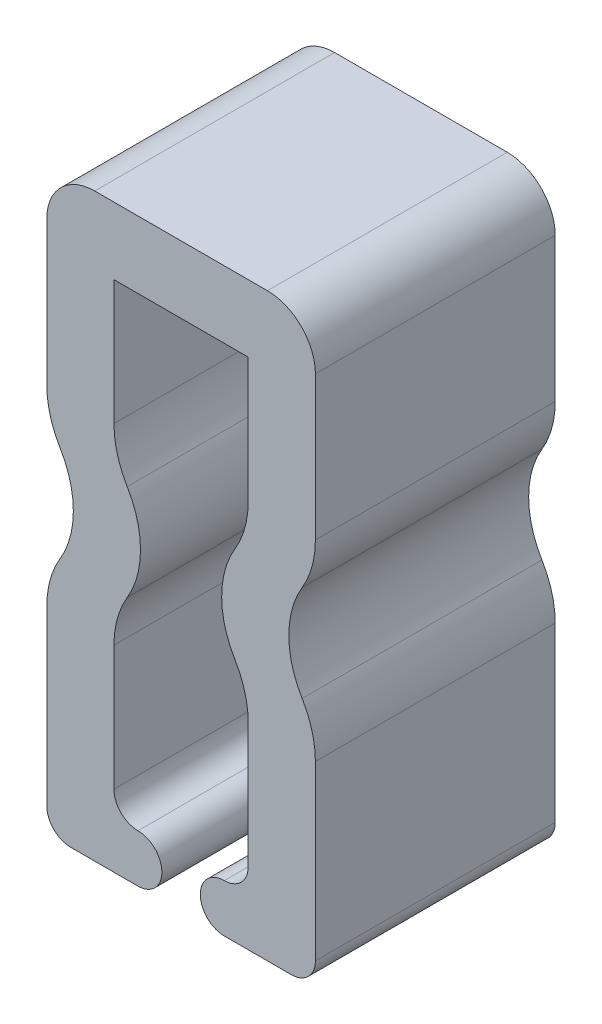
ISO-10303-21;
HEADER;
FILE_DESCRIPTION(('STEP AP214'),'2;1');
FILE_NAME('part.step','',(''),(''),'','','');
FILE_SCHEMA(('AUTOMOTIVE_DESIGN { 1 0 10303 214 1 1 1 1 }'));
ENDSEC;
DATA;
#1=APPLICATION_CONTEXT('core data for automotive mechanical design processes');
#2=APPLICATION_PROTOCOL_DEFINITION('international standard','automotive_design',2000,#1);
#3=PRODUCT_CONTEXT('',#1,'mechanical');
#4=PRODUCT('Part','Part','',(#3));
#5=PRODUCT_RELATED_PRODUCT_CATEGORY('part','',(#4));
#6=PRODUCT_DEFINITION_FORMATION('','',#4);
#7=PRODUCT_DEFINITION_CONTEXT('part definition',#1,'design');
#8=PRODUCT_DEFINITION('design','',#6,#7);
#9=PRODUCT_DEFINITION_SHAPE('','',#8);
#10=(LENGTH_UNIT() NAMED_UNIT(*) SI_UNIT(.MILLI.,.METRE.));
#11=(NAMED_UNIT(*) PLANE_ANGLE_UNIT() SI_UNIT($,.RADIAN.));
#12=(NAMED_UNIT(*) SI_UNIT($,.STERADIAN.) SOLID_ANGLE_UNIT());
#13=UNCERTAINTY_MEASURE_WITH_UNIT(LENGTH_MEASURE(1.E-05),#10,'distance_accuracy_value','');
#14=(GEOMETRIC_REPRESENTATION_CONTEXT(3) GLOBAL_UNCERTAINTY_ASSIGNED_CONTEXT((#13)) GLOBAL_UNIT_ASSIGNED_CONTEXT((#10,
#11,#12)) REPRESENTATION_CONTEXT('',''));
#15=CARTESIAN_POINT('',(0.,0.,0.));
#16=DIRECTION('',(0.,0.,1.));
#17=DIRECTION('',(1.,0.,0.));
#18=AXIS2_PLACEMENT_3D('',#15,#16,#17);
#19=CARTESIAN_POINT('',(-1.4,7.8,5.));
#20=DIRECTION('',(-1.,0.,0.));
#21=DIRECTION('',(0.,0.,1.));
#22=AXIS2_PLACEMENT_3D('',#19,#20,#21);
#23=PLANE('',#22);
#24=DIRECTION('',(0.,1.,0.));
#25=VECTOR('',#24,1.);
#26=CARTESIAN_POINT('',(-1.4,7.8,0.));
#27=LINE('',#26,#25);
#28=CARTESIAN_POINT('',(-1.4,5.2,0.));
#29=VERTEX_POINT('',#28);
#30=CARTESIAN_POINT('',(-1.4,7.8,0.));
#31=VERTEX_POINT('',#30);
#32=EDGE_CURVE('E276',#29,#31,#27,.T.);
#33=ORIENTED_EDGE('',*,*,#32,.T.);
#34=DIRECTION('',(0.,0.,-1.));
#35=VECTOR('',#34,1.);
#36=CARTESIAN_POINT('',(-1.4,7.8,5.));
#37=LINE('',#36,#35);
#38=CARTESIAN_POINT('',(-1.4,7.8,5.));
#39=VERTEX_POINT('',#38);
#40=EDGE_CURVE('E11',#39,#31,#37,.T.);
#41=ORIENTED_EDGE('',*,*,#40,.F.);
#42=DIRECTION('',(0.,1.,0.));
#43=VECTOR('',#42,1.);
#44=CARTESIAN_POINT('',(-1.4,7.8,5.));
#45=LINE('',#44,#43);
#46=CARTESIAN_POINT('',(-1.4,5.2,5.));
#47=VERTEX_POINT('',#46);
#48=EDGE_CURVE('E340',#47,#39,#45,.T.);
#49=ORIENTED_EDGE('',*,*,#48,.F.);
#50=DIRECTION('',(0.,0.,-1.));
#51=VECTOR('',#50,1.);
#52=CARTESIAN_POINT('',(-1.4,5.2,5.));
#53=LINE('',#52,#51);
#54=EDGE_CURVE('E272',#47,#29,#53,.T.);
#55=ORIENTED_EDGE('',*,*,#54,.T.);
#56=EDGE_LOOP('',(#33,#41,#49,#55));
#57=FACE_BOUND('',#56,.T.);
#58=ADVANCED_FACE('F36',(#57),#23,.F.);
#59=CARTESIAN_POINT('',(-1.4,7.8,5.));
#60=DIRECTION('',(0.,1.,0.));
#61=DIRECTION('',(0.,0.,1.));
#62=AXIS2_PLACEMENT_3D('',#59,#60,#61);
#63=PLANE('',#62);
#64=DIRECTION('',(1.,0.,0.));
#65=VECTOR('',#64,1.);
#66=CARTESIAN_POINT('',(-1.4,7.8,0.));
#67=LINE('',#66,#65);
#68=CARTESIAN_POINT('',(1.39999999999997,7.8,0.));
#69=VERTEX_POINT('',#68);
#70=EDGE_CURVE('E279',#31,#69,#67,.T.);
#71=ORIENTED_EDGE('',*,*,#70,.T.);
#72=DIRECTION('',(0.,0.,-1.));
#73=VECTOR('',#72,1.);
#74=CARTESIAN_POINT('',(1.39999999999997,7.8,5.));
#75=LINE('',#74,#73);
#76=CARTESIAN_POINT('',(1.39999999999997,7.8,5.));
#77=VERTEX_POINT('',#76);
#78=EDGE_CURVE('E44',#77,#69,#75,.T.);
#79=ORIENTED_EDGE('',*,*,#78,.F.);
#80=DIRECTION('',(1.,0.,0.));
#81=VECTOR('',#80,1.);
#82=CARTESIAN_POINT('',(-1.4,7.8,5.));
#83=LINE('',#82,#81);
#84=EDGE_CURVE('E167',#39,#77,#83,.T.);
#85=ORIENTED_EDGE('',*,*,#84,.F.);
#86=ORIENTED_EDGE('',*,*,#40,.T.);
#87=EDGE_LOOP('',(#71,#79,#85,#86));
#88=FACE_BOUND('',#87,.T.);
#89=ADVANCED_FACE('F518',(#88),#63,.F.);
#90=CARTESIAN_POINT('',(1.39999999999997,7.8,5.));
#91=DIRECTION('',(1.,0.,0.));
#92=DIRECTION('',(0.,1.,0.));
#93=AXIS2_PLACEMENT_3D('',#90,#91,#92);
#94=PLANE('',#93);
#95=DIRECTION('',(0.,-1.,0.));
#96=VECTOR('',#95,1.);
#97=CARTESIAN_POINT('',(1.39999999999997,7.8,0.));
#98=LINE('',#97,#96);
#99=CARTESIAN_POINT('',(1.39999999999999,5.2,0.));
#100=VERTEX_POINT('',#99);
#101=EDGE_CURVE('E281',#69,#100,#98,.T.);
#102=ORIENTED_EDGE('',*,*,#101,.T.);
#103=DIRECTION('',(0.,0.,-1.));
#104=VECTOR('',#103,1.);
#105=CARTESIAN_POINT('',(1.39999999999999,5.2,5.));
#106=LINE('',#105,#104);
#107=CARTESIAN_POINT('',(1.39999999999999,5.2,5.));
#108=VERTEX_POINT('',#107);
#109=EDGE_CURVE('E419',#108,#100,#106,.T.);
#110=ORIENTED_EDGE('',*,*,#109,.F.);
#111=DIRECTION('',(0.,-1.,0.));
#112=VECTOR('',#111,1.);
#113=CARTESIAN_POINT('',(1.39999999999997,7.8,5.));
#114=LINE('',#113,#112);
#115=EDGE_CURVE('E427',#77,#108,#114,.T.);
#116=ORIENTED_EDGE('',*,*,#115,.F.);
#117=ORIENTED_EDGE('',*,*,#78,.T.);
#118=EDGE_LOOP('',(#102,#110,#116,#117));
#119=FACE_BOUND('',#118,.T.);
#120=ADVANCED_FACE('F425',(#119),#94,.F.);
#121=CARTESIAN_POINT('',(-0.543650631615116,5.2,5.));
#122=DIRECTION('',(0.,0.,-1.));
#123=DIRECTION('',(-1.,0.,0.));
#124=AXIS2_PLACEMENT_3D('',#121,#122,#123);
#125=CYLINDRICAL_SURFACE('',#124,1.9436506316151);
#126=CARTESIAN_POINT('',(-0.543650631615116,5.2,0.));
#127=DIRECTION('',(0.,0.,-1.));
#128=DIRECTION('',(-1.,0.,0.));
#129=AXIS2_PLACEMENT_3D('',#126,#127,#128);
#130=CIRCLE('',#129,1.9436506316151);
#131=CARTESIAN_POINT('',(1.12301603505156,4.2,0.));
#132=VERTEX_POINT('',#131);
#133=EDGE_CURVE('E283',#100,#132,#130,.T.);
#134=ORIENTED_EDGE('',*,*,#133,.T.);
#135=DIRECTION('',(0.,0.,-1.));
#136=VECTOR('',#135,1.);
#137=CARTESIAN_POINT('',(1.12301603505156,4.2,5.));
#138=LINE('',#137,#136);
#139=CARTESIAN_POINT('',(1.12301603505156,4.2,5.));
#140=VERTEX_POINT('',#139);
#141=EDGE_CURVE('E416',#140,#132,#138,.T.);
#142=ORIENTED_EDGE('',*,*,#141,.F.);
#143=CARTESIAN_POINT('',(-0.543650631615116,5.2,5.));
#144=DIRECTION('',(0.,0.,-1.));
#145=DIRECTION('',(-1.,0.,0.));
#146=AXIS2_PLACEMENT_3D('',#143,#144,#145);
#147=CIRCLE('',#146,1.9436506316151);
#148=EDGE_CURVE('E445',#108,#140,#147,.T.);
#149=ORIENTED_EDGE('',*,*,#148,.F.);
#150=ORIENTED_EDGE('',*,*,#109,.T.);
#151=EDGE_LOOP('',(#134,#142,#149,#150));
#152=FACE_BOUND('',#151,.T.);
#153=ADVANCED_FACE('F436',(#152),#125,.F.);
#154=CARTESIAN_POINT('',(2.78968270171823,3.2,5.));
#155=DIRECTION('',(0.,0.,-1.));
#156=DIRECTION('',(-1.,0.,0.));
#157=AXIS2_PLACEMENT_3D('',#154,#155,#156);
#158=CYLINDRICAL_SURFACE('',#157,1.9436506316151);
#159=CARTESIAN_POINT('',(2.78968270171823,3.2,0.));
#160=DIRECTION('',(0.,0.,1.));
#161=DIRECTION('',(1.,0.,0.));
#162=AXIS2_PLACEMENT_3D('',#159,#160,#161);
#163=CIRCLE('',#162,1.9436506316151);
#164=CARTESIAN_POINT('',(1.12301603505157,2.2,0.));
#165=VERTEX_POINT('',#164);
#166=EDGE_CURVE('E285',#132,#165,#163,.T.);
#167=ORIENTED_EDGE('',*,*,#166,.T.);
#168=DIRECTION('',(0.,0.,-1.));
#169=VECTOR('',#168,1.);
#170=CARTESIAN_POINT('',(1.12301603505157,2.2,5.));
#171=LINE('',#170,#169);
#172=CARTESIAN_POINT('',(1.12301603505157,2.2,5.));
#173=VERTEX_POINT('',#172);
#174=EDGE_CURVE('E413',#173,#165,#171,.T.);
#175=ORIENTED_EDGE('',*,*,#174,.F.);
#176=CARTESIAN_POINT('',(2.78968270171823,3.2,5.));
#177=DIRECTION('',(0.,0.,1.));
#178=DIRECTION('',(1.,0.,0.));
#179=AXIS2_PLACEMENT_3D('',#176,#177,#178);
#180=CIRCLE('',#179,1.9436506316151);
#181=EDGE_CURVE('E442',#140,#173,#180,.T.);
#182=ORIENTED_EDGE('',*,*,#181,.F.);
#183=ORIENTED_EDGE('',*,*,#141,.T.);
#184=EDGE_LOOP('',(#167,#175,#182,#183));
#185=FACE_BOUND('',#184,.T.);
#186=ADVANCED_FACE('F440',(#185),#158,.T.);
#187=CARTESIAN_POINT('',(-0.543650631615089,1.2,5.));
#188=DIRECTION('',(0.,0.,-1.));
#189=DIRECTION('',(-1.,0.,0.));
#190=AXIS2_PLACEMENT_3D('',#187,#188,#189);
#191=CYLINDRICAL_SURFACE('',#190,1.9436506316151);
#192=CARTESIAN_POINT('',(-0.543650631615089,1.2,0.));
#193=DIRECTION('',(0.,0.,-1.));
#194=DIRECTION('',(1.,0.,0.));
#195=AXIS2_PLACEMENT_3D('',#192,#193,#194);
#196=CIRCLE('',#195,1.9436506316151);
#197=CARTESIAN_POINT('',(1.40000000000001,1.2,0.));
#198=VERTEX_POINT('',#197);
#199=EDGE_CURVE('E287',#165,#198,#196,.T.);
#200=ORIENTED_EDGE('',*,*,#199,.T.);
#201=DIRECTION('',(0.,0.,-1.));
#202=VECTOR('',#201,1.);
#203=CARTESIAN_POINT('',(1.40000000000001,1.2,5.));
#204=LINE('',#203,#202);
#205=CARTESIAN_POINT('',(1.40000000000001,1.2,5.));
#206=VERTEX_POINT('',#205);
#207=EDGE_CURVE('E410',#206,#198,#204,.T.);
#208=ORIENTED_EDGE('',*,*,#207,.F.);
#209=CARTESIAN_POINT('',(-0.543650631615089,1.2,5.));
#210=DIRECTION('',(0.,0.,-1.));
#211=DIRECTION('',(1.,0.,0.));
#212=AXIS2_PLACEMENT_3D('',#209,#210,#211);
#213=CIRCLE('',#212,1.9436506316151);
#214=EDGE_CURVE('E444',#173,#206,#213,.T.);
#215=ORIENTED_EDGE('',*,*,#214,.F.);
#216=ORIENTED_EDGE('',*,*,#174,.T.);
#217=EDGE_LOOP('',(#200,#208,#215,#216));
#218=FACE_BOUND('',#217,.T.);
#219=ADVANCED_FACE('F531',(#218),#191,.F.);
#220=CARTESIAN_POINT('',(1.40000000000003,-1.4,5.));
#221=DIRECTION('',(1.,0.,0.));
#222=DIRECTION('',(0.,1.,0.));
#223=AXIS2_PLACEMENT_3D('',#220,#221,#222);
#224=PLANE('',#223);
#225=DIRECTION('',(0.,-1.,0.));
#226=VECTOR('',#225,1.);
#227=CARTESIAN_POINT('',(1.40000000000003,-1.4,0.));
#228=LINE('',#227,#226);
#229=CARTESIAN_POINT('',(1.40000000000003,-1.4,0.));
#230=VERTEX_POINT('',#229);
#231=EDGE_CURVE('E289',#198,#230,#228,.T.);
#232=ORIENTED_EDGE('',*,*,#231,.T.);
#233=DIRECTION('',(0.,0.,-1.));
#234=VECTOR('',#233,1.);
#235=CARTESIAN_POINT('',(1.40000000000003,-1.4,5.));
#236=LINE('',#235,#234);
#237=CARTESIAN_POINT('',(1.40000000000003,-1.4,5.));
#238=VERTEX_POINT('',#237);
#239=EDGE_CURVE('E407',#238,#230,#236,.T.);
#240=ORIENTED_EDGE('',*,*,#239,.F.);
#241=DIRECTION('',(0.,-1.,0.));
#242=VECTOR('',#241,1.);
#243=CARTESIAN_POINT('',(1.40000000000003,-1.4,5.));
#244=LINE('',#243,#242);
#245=EDGE_CURVE('E447',#206,#238,#244,.T.);
#246=ORIENTED_EDGE('',*,*,#245,.F.);
#247=ORIENTED_EDGE('',*,*,#207,.T.);
#248=EDGE_LOOP('',(#232,#240,#246,#247));
#249=FACE_BOUND('',#248,.T.);
#250=ADVANCED_FACE('F534',(#249),#224,.F.);
#251=CARTESIAN_POINT('',(0.900000000000031,-1.4,5.));
#252=DIRECTION('',(0.,0.,-1.));
#253=DIRECTION('',(-1.,0.,0.));
#254=AXIS2_PLACEMENT_3D('',#251,#252,#253);
#255=CYLINDRICAL_SURFACE('',#254,0.5);
#256=CARTESIAN_POINT('',(0.900000000000031,-1.4,0.));
#257=DIRECTION('',(0.,0.,-1.));
#258=DIRECTION('',(-1.,0.,0.));
#259=AXIS2_PLACEMENT_3D('',#256,#257,#258);
#260=CIRCLE('',#259,0.5);
#261=CARTESIAN_POINT('',(0.900000000000035,-1.9,0.));
#262=VERTEX_POINT('',#261);
#263=EDGE_CURVE('E291',#230,#262,#260,.T.);
#264=ORIENTED_EDGE('',*,*,#263,.T.);
#265=DIRECTION('',(0.,0.,-1.));
#266=VECTOR('',#265,1.);
#267=CARTESIAN_POINT('',(0.900000000000035,-1.9,5.));
#268=LINE('',#267,#266);
#269=CARTESIAN_POINT('',(0.900000000000035,-1.9,5.));
#270=VERTEX_POINT('',#269);
#271=EDGE_CURVE('E404',#270,#262,#268,.T.);
#272=ORIENTED_EDGE('',*,*,#271,.F.);
#273=CARTESIAN_POINT('',(0.900000000000031,-1.4,5.));
#274=DIRECTION('',(0.,0.,-1.));
#275=DIRECTION('',(-1.,0.,0.));
#276=AXIS2_PLACEMENT_3D('',#273,#274,#275);
#277=CIRCLE('',#276,0.5);
#278=EDGE_CURVE('E453',#238,#270,#277,.T.);
#279=ORIENTED_EDGE('',*,*,#278,.F.);
#280=ORIENTED_EDGE('',*,*,#239,.T.);
#281=EDGE_LOOP('',(#264,#272,#279,#280));
#282=FACE_BOUND('',#281,.T.);
#283=ADVANCED_FACE('F538',(#282),#255,.F.);
#284=CARTESIAN_POINT('',(0.900000000000038,-2.4,5.));
#285=DIRECTION('',(0.,0.,-1.));
#286=DIRECTION('',(-1.,0.,0.));
#287=AXIS2_PLACEMENT_3D('',#284,#285,#286);
#288=CYLINDRICAL_SURFACE('',#287,0.5);
#289=CARTESIAN_POINT('',(0.900000000000038,-2.4,0.));
#290=DIRECTION('',(0.,0.,1.));
#291=DIRECTION('',(1.,0.,0.));
#292=AXIS2_PLACEMENT_3D('',#289,#290,#291);
#293=CIRCLE('',#292,0.5);
#294=CARTESIAN_POINT('',(0.900000000000041,-2.9,0.));
#295=VERTEX_POINT('',#294);
#296=EDGE_CURVE('E294',#262,#295,#293,.T.);
#297=ORIENTED_EDGE('',*,*,#296,.T.);
#298=DIRECTION('',(0.,0.,-1.));
#299=VECTOR('',#298,1.);
#300=CARTESIAN_POINT('',(0.900000000000041,-2.9,5.));
#301=LINE('',#300,#299);
#302=CARTESIAN_POINT('',(0.900000000000041,-2.9,5.));
#303=VERTEX_POINT('',#302);
#304=EDGE_CURVE('E401',#303,#295,#301,.T.);
#305=ORIENTED_EDGE('',*,*,#304,.F.);
#306=CARTESIAN_POINT('',(0.900000000000038,-2.4,5.));
#307=DIRECTION('',(0.,0.,1.));
#308=DIRECTION('',(1.,0.,0.));
#309=AXIS2_PLACEMENT_3D('',#306,#307,#308);
#310=CIRCLE('',#309,0.5);
#311=EDGE_CURVE('E455',#270,#303,#310,.T.);
#312=ORIENTED_EDGE('',*,*,#311,.F.);
#313=ORIENTED_EDGE('',*,*,#271,.T.);
#314=EDGE_LOOP('',(#297,#305,#312,#313));
#315=FACE_BOUND('',#314,.T.);
#316=ADVANCED_FACE('F542',(#315),#288,.T.);
#317=CARTESIAN_POINT('',(2.3,-2.9,5.));
#318=DIRECTION('',(0.,1.,0.));
#319=DIRECTION('',(0.,0.,1.));
#320=AXIS2_PLACEMENT_3D('',#317,#318,#319);
#321=PLANE('',#320);
#322=DIRECTION('',(1.,0.,0.));
#323=VECTOR('',#322,1.);
#324=CARTESIAN_POINT('',(2.3,-2.9,0.));
#325=LINE('',#324,#323);
#326=CARTESIAN_POINT('',(2.3,-2.9,0.));
#327=VERTEX_POINT('',#326);
#328=EDGE_CURVE('E296',#295,#327,#325,.T.);
#329=ORIENTED_EDGE('',*,*,#328,.T.);
#330=DIRECTION('',(0.,0.,-1.));
#331=VECTOR('',#330,1.);
#332=CARTESIAN_POINT('',(2.3,-2.9,5.));
#333=LINE('',#332,#331);
#334=CARTESIAN_POINT('',(2.3,-2.9,5.));
#335=VERTEX_POINT('',#334);
#336=EDGE_CURVE('E398',#335,#327,#333,.T.);
#337=ORIENTED_EDGE('',*,*,#336,.F.);
#338=DIRECTION('',(1.,0.,0.));
#339=VECTOR('',#338,1.);
#340=CARTESIAN_POINT('',(2.3,-2.9,5.));
#341=LINE('',#340,#339);
#342=EDGE_CURVE('E457',#303,#335,#341,.T.);
#343=ORIENTED_EDGE('',*,*,#342,.F.);
#344=ORIENTED_EDGE('',*,*,#304,.T.);
#345=EDGE_LOOP('',(#329,#337,#343,#344));
#346=FACE_BOUND('',#345,.T.);
#347=ADVANCED_FACE('F546',(#346),#321,.F.);
#348=CARTESIAN_POINT('',(2.3,-2.4,5.));
#349=DIRECTION('',(0.,0.,-1.));
#350=DIRECTION('',(-1.,0.,0.));
#351=AXIS2_PLACEMENT_3D('',#348,#349,#350);
#352=CYLINDRICAL_SURFACE('',#351,0.5);
#353=CARTESIAN_POINT('',(2.3,-2.4,0.));
#354=DIRECTION('',(0.,0.,1.));
#355=DIRECTION('',(-1.,0.,0.));
#356=AXIS2_PLACEMENT_3D('',#353,#354,#355);
#357=CIRCLE('',#356,0.5);
#358=CARTESIAN_POINT('',(2.8,-2.4,0.));
#359=VERTEX_POINT('',#358);
#360=EDGE_CURVE('E298',#327,#359,#357,.T.);
#361=ORIENTED_EDGE('',*,*,#360,.T.);
#362=DIRECTION('',(0.,0.,-1.));
#363=VECTOR('',#362,1.);
#364=CARTESIAN_POINT('',(2.8,-2.4,5.));
#365=LINE('',#364,#363);
#366=CARTESIAN_POINT('',(2.8,-2.4,5.));
#367=VERTEX_POINT('',#366);
#368=EDGE_CURVE('E395',#367,#359,#365,.T.);
#369=ORIENTED_EDGE('',*,*,#368,.F.);
#370=CARTESIAN_POINT('',(2.3,-2.4,5.));
#371=DIRECTION('',(0.,0.,1.));
#372=DIRECTION('',(-1.,0.,0.));
#373=AXIS2_PLACEMENT_3D('',#370,#371,#372);
#374=CIRCLE('',#373,0.5);
#375=EDGE_CURVE('E459',#335,#367,#374,.T.);
#376=ORIENTED_EDGE('',*,*,#375,.F.);
#377=ORIENTED_EDGE('',*,*,#336,.T.);
#378=EDGE_LOOP('',(#361,#369,#376,#377));
#379=FACE_BOUND('',#378,.T.);
#380=ADVANCED_FACE('F550',(#379),#352,.T.);
#381=CARTESIAN_POINT('',(2.8,1.2,5.));
#382=DIRECTION('',(-1.,0.,0.));
#383=DIRECTION('',(0.,-1.,0.));
#384=AXIS2_PLACEMENT_3D('',#381,#382,#383);
#385=PLANE('',#384);
#386=DIRECTION('',(0.,1.,0.));
#387=VECTOR('',#386,1.);
#388=CARTESIAN_POINT('',(2.8,1.2,0.));
#389=LINE('',#388,#387);
#390=CARTESIAN_POINT('',(2.8,1.2,0.));
#391=VERTEX_POINT('',#390);
#392=EDGE_CURVE('E300',#359,#391,#389,.T.);
#393=ORIENTED_EDGE('',*,*,#392,.T.);
#394=DIRECTION('',(0.,0.,-1.));
#395=VECTOR('',#394,1.);
#396=CARTESIAN_POINT('',(2.8,1.2,5.));
#397=LINE('',#396,#395);
#398=CARTESIAN_POINT('',(2.8,1.2,5.));
#399=VERTEX_POINT('',#398);
#400=EDGE_CURVE('E392',#399,#391,#397,.T.);
#401=ORIENTED_EDGE('',*,*,#400,.F.);
#402=DIRECTION('',(0.,1.,0.));
#403=VECTOR('',#402,1.);
#404=CARTESIAN_POINT('',(2.8,1.2,5.));
#405=LINE('',#404,#403);
#406=EDGE_CURVE('E461',#367,#399,#405,.T.);
#407=ORIENTED_EDGE('',*,*,#406,.F.);
#408=ORIENTED_EDGE('',*,*,#368,.T.);
#409=EDGE_LOOP('',(#393,#401,#407,#408));
#410=FACE_BOUND('',#409,.T.);
#411=ADVANCED_FACE('F554',(#410),#385,.F.);
#412=CARTESIAN_POINT('',(0.856349368384897,1.2,5.));
#413=DIRECTION('',(0.,0.,-1.));
#414=DIRECTION('',(-1.,0.,0.));
#415=AXIS2_PLACEMENT_3D('',#412,#413,#414);
#416=CYLINDRICAL_SURFACE('',#415,1.9436506316151);
#417=CARTESIAN_POINT('',(0.856349368384897,1.2,0.));
#418=DIRECTION('',(0.,0.,1.));
#419=DIRECTION('',(1.,0.,0.));
#420=AXIS2_PLACEMENT_3D('',#417,#418,#419);
#421=CIRCLE('',#420,1.9436506316151);
#422=CARTESIAN_POINT('',(2.52301603505157,2.2,0.));
#423=VERTEX_POINT('',#422);
#424=EDGE_CURVE('E302',#391,#423,#421,.T.);
#425=ORIENTED_EDGE('',*,*,#424,.T.);
#426=DIRECTION('',(0.,0.,-1.));
#427=VECTOR('',#426,1.);
#428=CARTESIAN_POINT('',(2.52301603505157,2.2,5.));
#429=LINE('',#428,#427);
#430=CARTESIAN_POINT('',(2.52301603505157,2.2,5.));
#431=VERTEX_POINT('',#430);
#432=EDGE_CURVE('E389',#431,#423,#429,.T.);
#433=ORIENTED_EDGE('',*,*,#432,.F.);
#434=CARTESIAN_POINT('',(0.856349368384897,1.2,5.));
#435=DIRECTION('',(0.,0.,1.));
#436=DIRECTION('',(1.,0.,0.));
#437=AXIS2_PLACEMENT_3D('',#434,#435,#436);
#438=CIRCLE('',#437,1.9436506316151);
#439=EDGE_CURVE('E463',#399,#431,#438,.T.);
#440=ORIENTED_EDGE('',*,*,#439,.F.);
#441=ORIENTED_EDGE('',*,*,#400,.T.);
#442=EDGE_LOOP('',(#425,#433,#440,#441));
#443=FACE_BOUND('',#442,.T.);
#444=ADVANCED_FACE('F558',(#443),#416,.T.);
#445=CARTESIAN_POINT('',(4.18968270171823,3.2,5.));
#446=DIRECTION('',(0.,0.,-1.));
#447=DIRECTION('',(-1.,0.,0.));
#448=AXIS2_PLACEMENT_3D('',#445,#446,#447);
#449=CYLINDRICAL_SURFACE('',#448,1.9436506316151);
#450=CARTESIAN_POINT('',(4.18968270171823,3.2,0.));
#451=DIRECTION('',(0.,0.,-1.));
#452=DIRECTION('',(1.,0.,0.));
#453=AXIS2_PLACEMENT_3D('',#450,#451,#452);
#454=CIRCLE('',#453,1.9436506316151);
#455=CARTESIAN_POINT('',(2.52301603505157,4.2,0.));
#456=VERTEX_POINT('',#455);
#457=EDGE_CURVE('E304',#423,#456,#454,.T.);
#458=ORIENTED_EDGE('',*,*,#457,.T.);
#459=DIRECTION('',(0.,0.,-1.));
#460=VECTOR('',#459,1.);
#461=CARTESIAN_POINT('',(2.52301603505157,4.2,5.));
#462=LINE('',#461,#460);
#463=CARTESIAN_POINT('',(2.52301603505157,4.2,5.));
#464=VERTEX_POINT('',#463);
#465=EDGE_CURVE('E386',#464,#456,#462,.T.);
#466=ORIENTED_EDGE('',*,*,#465,.F.);
#467=CARTESIAN_POINT('',(4.18968270171823,3.2,5.));
#468=DIRECTION('',(0.,0.,-1.));
#469=DIRECTION('',(1.,0.,0.));
#470=AXIS2_PLACEMENT_3D('',#467,#468,#469);
#471=CIRCLE('',#470,1.9436506316151);
#472=EDGE_CURVE('E465',#431,#464,#471,.T.);
#473=ORIENTED_EDGE('',*,*,#472,.F.);
#474=ORIENTED_EDGE('',*,*,#432,.T.);
#475=EDGE_LOOP('',(#458,#466,#473,#474));
#476=FACE_BOUND('',#475,.T.);
#477=ADVANCED_FACE('F562',(#476),#449,.F.);
#478=CARTESIAN_POINT('',(0.856349368384898,5.2,5.));
#479=DIRECTION('',(0.,0.,-1.));
#480=DIRECTION('',(-1.,0.,0.));
#481=AXIS2_PLACEMENT_3D('',#478,#479,#480);
#482=CYLINDRICAL_SURFACE('',#481,1.9436506316151);
#483=CARTESIAN_POINT('',(0.856349368384898,5.2,0.));
#484=DIRECTION('',(0.,0.,1.));
#485=DIRECTION('',(-1.,0.,0.));
#486=AXIS2_PLACEMENT_3D('',#483,#484,#485);
#487=CIRCLE('',#486,1.9436506316151);
#488=CARTESIAN_POINT('',(2.8,5.2,0.));
#489=VERTEX_POINT('',#488);
#490=EDGE_CURVE('E306',#456,#489,#487,.T.);
#491=ORIENTED_EDGE('',*,*,#490,.T.);
#492=DIRECTION('',(0.,0.,-1.));
#493=VECTOR('',#492,1.);
#494=CARTESIAN_POINT('',(2.8,5.2,5.));
#495=LINE('',#494,#493);
#496=CARTESIAN_POINT('',(2.8,5.2,5.));
#497=VERTEX_POINT('',#496);
#498=EDGE_CURVE('E383',#497,#489,#495,.T.);
#499=ORIENTED_EDGE('',*,*,#498,.F.);
#500=CARTESIAN_POINT('',(0.856349368384898,5.2,5.));
#501=DIRECTION('',(0.,0.,1.));
#502=DIRECTION('',(-1.,0.,0.));
#503=AXIS2_PLACEMENT_3D('',#500,#501,#502);
#504=CIRCLE('',#503,1.9436506316151);
#505=EDGE_CURVE('E467',#464,#497,#504,.T.);
#506=ORIENTED_EDGE('',*,*,#505,.F.);
#507=ORIENTED_EDGE('',*,*,#465,.T.);
#508=EDGE_LOOP('',(#491,#499,#506,#507));
#509=FACE_BOUND('',#508,.T.);
#510=ADVANCED_FACE('F566',(#509),#482,.T.);
#511=CARTESIAN_POINT('',(2.8,8.19999999999987,5.));
#512=DIRECTION('',(-1.,0.,0.));
#513=DIRECTION('',(0.,-1.,0.));
#514=AXIS2_PLACEMENT_3D('',#511,#512,#513);
#515=PLANE('',#514);
#516=DIRECTION('',(0.,1.,0.));
#517=VECTOR('',#516,1.);
#518=CARTESIAN_POINT('',(2.8,8.19999999999987,0.));
#519=LINE('',#518,#517);
#520=CARTESIAN_POINT('',(2.8,8.19999999999987,0.));
#521=VERTEX_POINT('',#520);
#522=EDGE_CURVE('E308',#489,#521,#519,.T.);
#523=ORIENTED_EDGE('',*,*,#522,.T.);
#524=DIRECTION('',(0.,0.,-1.));
#525=VECTOR('',#524,1.);
#526=CARTESIAN_POINT('',(2.8,8.19999999999987,5.));
#527=LINE('',#526,#525);
#528=CARTESIAN_POINT('',(2.8,8.19999999999987,5.));
#529=VERTEX_POINT('',#528);
#530=EDGE_CURVE('E380',#529,#521,#527,.T.);
#531=ORIENTED_EDGE('',*,*,#530,.F.);
#532=DIRECTION('',(0.,1.,0.));
#533=VECTOR('',#532,1.);
#534=CARTESIAN_POINT('',(2.8,8.19999999999987,5.));
#535=LINE('',#534,#533);
#536=EDGE_CURVE('E469',#497,#529,#535,.T.);
#537=ORIENTED_EDGE('',*,*,#536,.F.);
#538=ORIENTED_EDGE('',*,*,#498,.T.);
#539=EDGE_LOOP('',(#523,#531,#537,#538));
#540=FACE_BOUND('',#539,.T.);
#541=ADVANCED_FACE('F570',(#540),#515,.F.);
#542=CARTESIAN_POINT('',(1.8,8.19999999999987,5.));
#543=DIRECTION('',(0.,0.,-1.));
#544=DIRECTION('',(-1.,0.,0.));
#545=AXIS2_PLACEMENT_3D('',#542,#543,#544);
#546=CYLINDRICAL_SURFACE('',#545,1.);
#547=CARTESIAN_POINT('',(1.8,8.19999999999987,0.));
#548=DIRECTION('',(0.,0.,1.));
#549=DIRECTION('',(1.,0.,0.));
#550=AXIS2_PLACEMENT_3D('',#547,#548,#549);
#551=CIRCLE('',#550,1.);
#552=CARTESIAN_POINT('',(1.8,9.19999999999987,0.));
#553=VERTEX_POINT('',#552);
#554=EDGE_CURVE('E310',#521,#553,#551,.T.);
#555=ORIENTED_EDGE('',*,*,#554,.T.);
#556=DIRECTION('',(0.,0.,-1.));
#557=VECTOR('',#556,1.);
#558=CARTESIAN_POINT('',(1.8,9.19999999999987,5.));
#559=LINE('',#558,#557);
#560=CARTESIAN_POINT('',(1.8,9.19999999999987,5.));
#561=VERTEX_POINT('',#560);
#562=EDGE_CURVE('E377',#561,#553,#559,.T.);
#563=ORIENTED_EDGE('',*,*,#562,.F.);
#564=CARTESIAN_POINT('',(1.8,8.19999999999987,5.));
#565=DIRECTION('',(0.,0.,1.));
#566=DIRECTION('',(1.,0.,0.));
#567=AXIS2_PLACEMENT_3D('',#564,#565,#566);
#568=CIRCLE('',#567,1.);
#569=EDGE_CURVE('E471',#529,#561,#568,.T.);
#570=ORIENTED_EDGE('',*,*,#569,.F.);
#571=ORIENTED_EDGE('',*,*,#530,.T.);
#572=EDGE_LOOP('',(#555,#563,#570,#571));
#573=FACE_BOUND('',#572,.T.);
#574=ADVANCED_FACE('F574',(#573),#546,.T.);
#575=CARTESIAN_POINT('',(1.8,9.19999999999987,5.));
#576=DIRECTION('',(0.,-1.,0.));
#577=DIRECTION('',(0.,0.,-1.));
#578=AXIS2_PLACEMENT_3D('',#575,#576,#577);
#579=PLANE('',#578);
#580=DIRECTION('',(-1.,0.,0.));
#581=VECTOR('',#580,1.);
#582=CARTESIAN_POINT('',(1.8,9.19999999999987,0.));
#583=LINE('',#582,#581);
#584=CARTESIAN_POINT('',(-1.8,9.19999999999987,0.));
#585=VERTEX_POINT('',#584);
#586=EDGE_CURVE('E312',#553,#585,#583,.T.);
#587=ORIENTED_EDGE('',*,*,#586,.T.);
#588=DIRECTION('',(0.,0.,-1.));
#589=VECTOR('',#588,1.);
#590=CARTESIAN_POINT('',(-1.8,9.19999999999987,5.));
#591=LINE('',#590,#589);
#592=CARTESIAN_POINT('',(-1.8,9.19999999999987,5.));
#593=VERTEX_POINT('',#592);
#594=EDGE_CURVE('E374',#593,#585,#591,.T.);
#595=ORIENTED_EDGE('',*,*,#594,.F.);
#596=DIRECTION('',(-1.,0.,0.));
#597=VECTOR('',#596,1.);
#598=CARTESIAN_POINT('',(1.8,9.19999999999987,5.));
#599=LINE('',#598,#597);
#600=EDGE_CURVE('E473',#561,#593,#599,.T.);
#601=ORIENTED_EDGE('',*,*,#600,.F.);
#602=ORIENTED_EDGE('',*,*,#562,.T.);
#603=EDGE_LOOP('',(#587,#595,#601,#602));
#604=FACE_BOUND('',#603,.T.);
#605=ADVANCED_FACE('F578',(#604),#579,.F.);
#606=CARTESIAN_POINT('',(-1.8,8.19999999999987,5.));
#607=DIRECTION('',(0.,0.,-1.));
#608=DIRECTION('',(-1.,0.,0.));
#609=AXIS2_PLACEMENT_3D('',#606,#607,#608);
#610=CYLINDRICAL_SURFACE('',#609,1.);
#611=CARTESIAN_POINT('',(-1.8,8.19999999999987,0.));
#612=DIRECTION('',(0.,0.,1.));
#613=DIRECTION('',(-1.,0.,0.));
#614=AXIS2_PLACEMENT_3D('',#611,#612,#613);
#615=CIRCLE('',#614,1.);
#616=CARTESIAN_POINT('',(-2.8,8.19999999999987,0.));
#617=VERTEX_POINT('',#616);
#618=EDGE_CURVE('E314',#585,#617,#615,.T.);
#619=ORIENTED_EDGE('',*,*,#618,.T.);
#620=DIRECTION('',(0.,0.,-1.));
#621=VECTOR('',#620,1.);
#622=CARTESIAN_POINT('',(-2.8,8.19999999999987,5.));
#623=LINE('',#622,#621);
#624=CARTESIAN_POINT('',(-2.8,8.19999999999987,5.));
#625=VERTEX_POINT('',#624);
#626=EDGE_CURVE('E371',#625,#617,#623,.T.);
#627=ORIENTED_EDGE('',*,*,#626,.F.);
#628=CARTESIAN_POINT('',(-1.8,8.19999999999987,5.));
#629=DIRECTION('',(0.,0.,1.));
#630=DIRECTION('',(-1.,0.,0.));
#631=AXIS2_PLACEMENT_3D('',#628,#629,#630);
#632=CIRCLE('',#631,1.);
#633=EDGE_CURVE('E475',#593,#625,#632,.T.);
#634=ORIENTED_EDGE('',*,*,#633,.F.);
#635=ORIENTED_EDGE('',*,*,#594,.T.);
#636=EDGE_LOOP('',(#619,#627,#634,#635));
#637=FACE_BOUND('',#636,.T.);
#638=ADVANCED_FACE('F582',(#637),#610,.T.);
#639=CARTESIAN_POINT('',(-2.8,8.19999999999987,5.));
#640=DIRECTION('',(1.,0.,0.));
#641=DIRECTION('',(0.,1.,0.));
#642=AXIS2_PLACEMENT_3D('',#639,#640,#641);
#643=PLANE('',#642);
#644=DIRECTION('',(0.,-1.,0.));
#645=VECTOR('',#644,1.);
#646=CARTESIAN_POINT('',(-2.8,8.19999999999987,0.));
#647=LINE('',#646,#645);
#648=CARTESIAN_POINT('',(-2.8,5.2,0.));
#649=VERTEX_POINT('',#648);
#650=EDGE_CURVE('E316',#617,#649,#647,.T.);
#651=ORIENTED_EDGE('',*,*,#650,.T.);
#652=DIRECTION('',(0.,0.,-1.));
#653=VECTOR('',#652,1.);
#654=CARTESIAN_POINT('',(-2.8,5.2,5.));
#655=LINE('',#654,#653);
#656=CARTESIAN_POINT('',(-2.8,5.2,5.));
#657=VERTEX_POINT('',#656);
#658=EDGE_CURVE('E368',#657,#649,#655,.T.);
#659=ORIENTED_EDGE('',*,*,#658,.F.);
#660=DIRECTION('',(0.,-1.,0.));
#661=VECTOR('',#660,1.);
#662=CARTESIAN_POINT('',(-2.8,8.19999999999987,5.));
#663=LINE('',#662,#661);
#664=EDGE_CURVE('E477',#625,#657,#663,.T.);
#665=ORIENTED_EDGE('',*,*,#664,.F.);
#666=ORIENTED_EDGE('',*,*,#626,.T.);
#667=EDGE_LOOP('',(#651,#659,#665,#666));
#668=FACE_BOUND('',#667,.T.);
#669=ADVANCED_FACE('F586',(#668),#643,.F.);
#670=CARTESIAN_POINT('',(-0.856349368384898,5.2,5.));
#671=DIRECTION('',(0.,0.,-1.));
#672=DIRECTION('',(-1.,0.,0.));
#673=AXIS2_PLACEMENT_3D('',#670,#671,#672);
#674=CYLINDRICAL_SURFACE('',#673,1.9436506316151);
#675=CARTESIAN_POINT('',(-0.856349368384898,5.2,0.));
#676=DIRECTION('',(0.,0.,1.));
#677=DIRECTION('',(1.,0.,0.));
#678=AXIS2_PLACEMENT_3D('',#675,#676,#677);
#679=CIRCLE('',#678,1.9436506316151);
#680=CARTESIAN_POINT('',(-2.52301603505157,4.2,0.));
#681=VERTEX_POINT('',#680);
#682=EDGE_CURVE('E318',#649,#681,#679,.T.);
#683=ORIENTED_EDGE('',*,*,#682,.T.);
#684=DIRECTION('',(0.,0.,-1.));
#685=VECTOR('',#684,1.);
#686=CARTESIAN_POINT('',(-2.52301603505157,4.2,5.));
#687=LINE('',#686,#685);
#688=CARTESIAN_POINT('',(-2.52301603505157,4.2,5.));
#689=VERTEX_POINT('',#688);
#690=EDGE_CURVE('E365',#689,#681,#687,.T.);
#691=ORIENTED_EDGE('',*,*,#690,.F.);
#692=CARTESIAN_POINT('',(-0.856349368384898,5.2,5.));
#693=DIRECTION('',(0.,0.,1.));
#694=DIRECTION('',(1.,0.,0.));
#695=AXIS2_PLACEMENT_3D('',#692,#693,#694);
#696=CIRCLE('',#695,1.9436506316151);
#697=EDGE_CURVE('E479',#657,#689,#696,.T.);
#698=ORIENTED_EDGE('',*,*,#697,.F.);
#699=ORIENTED_EDGE('',*,*,#658,.T.);
#700=EDGE_LOOP('',(#683,#691,#698,#699));
#701=FACE_BOUND('',#700,.T.);
#702=ADVANCED_FACE('F590',(#701),#674,.T.);
#703=CARTESIAN_POINT('',(-4.18968270171823,3.2,5.));
#704=DIRECTION('',(0.,0.,-1.));
#705=DIRECTION('',(-1.,0.,0.));
#706=AXIS2_PLACEMENT_3D('',#703,#704,#705);
#707=CYLINDRICAL_SURFACE('',#706,1.9436506316151);
#708=CARTESIAN_POINT('',(-4.18968270171823,3.2,0.));
#709=DIRECTION('',(0.,0.,-1.));
#710=DIRECTION('',(-1.,0.,0.));
#711=AXIS2_PLACEMENT_3D('',#708,#709,#710);
#712=CIRCLE('',#711,1.9436506316151);
#713=CARTESIAN_POINT('',(-2.52301603505156,2.2,0.));
#714=VERTEX_POINT('',#713);
#715=EDGE_CURVE('E320',#681,#714,#712,.T.);
#716=ORIENTED_EDGE('',*,*,#715,.T.);
#717=DIRECTION('',(0.,0.,-1.));
#718=VECTOR('',#717,1.);
#719=CARTESIAN_POINT('',(-2.52301603505156,2.2,5.));
#720=LINE('',#719,#718);
#721=CARTESIAN_POINT('',(-2.52301603505156,2.2,5.));
#722=VERTEX_POINT('',#721);
#723=EDGE_CURVE('E362',#722,#714,#720,.T.);
#724=ORIENTED_EDGE('',*,*,#723,.F.);
#725=CARTESIAN_POINT('',(-4.18968270171823,3.2,5.));
#726=DIRECTION('',(0.,0.,-1.));
#727=DIRECTION('',(-1.,0.,0.));
#728=AXIS2_PLACEMENT_3D('',#725,#726,#727);
#729=CIRCLE('',#728,1.9436506316151);
#730=EDGE_CURVE('E481',#689,#722,#729,.T.);
#731=ORIENTED_EDGE('',*,*,#730,.F.);
#732=ORIENTED_EDGE('',*,*,#690,.T.);
#733=EDGE_LOOP('',(#716,#724,#731,#732));
#734=FACE_BOUND('',#733,.T.);
#735=ADVANCED_FACE('F594',(#734),#707,.F.);
#736=CARTESIAN_POINT('',(-0.856349368384897,1.2,5.));
#737=DIRECTION('',(0.,0.,-1.));
#738=DIRECTION('',(-1.,0.,0.));
#739=AXIS2_PLACEMENT_3D('',#736,#737,#738);
#740=CYLINDRICAL_SURFACE('',#739,1.9436506316151);
#741=CARTESIAN_POINT('',(-0.856349368384897,1.2,0.));
#742=DIRECTION('',(0.,0.,1.));
#743=DIRECTION('',(-1.,0.,0.));
#744=AXIS2_PLACEMENT_3D('',#741,#742,#743);
#745=CIRCLE('',#744,1.9436506316151);
#746=CARTESIAN_POINT('',(-2.8,1.2,0.));
#747=VERTEX_POINT('',#746);
#748=EDGE_CURVE('E322',#714,#747,#745,.T.);
#749=ORIENTED_EDGE('',*,*,#748,.T.);
#750=DIRECTION('',(0.,0.,-1.));
#751=VECTOR('',#750,1.);
#752=CARTESIAN_POINT('',(-2.8,1.2,5.));
#753=LINE('',#752,#751);
#754=CARTESIAN_POINT('',(-2.8,1.2,5.));
#755=VERTEX_POINT('',#754);
#756=EDGE_CURVE('E359',#755,#747,#753,.T.);
#757=ORIENTED_EDGE('',*,*,#756,.F.);
#758=CARTESIAN_POINT('',(-0.856349368384897,1.2,5.));
#759=DIRECTION('',(0.,0.,1.));
#760=DIRECTION('',(-1.,0.,0.));
#761=AXIS2_PLACEMENT_3D('',#758,#759,#760);
#762=CIRCLE('',#761,1.9436506316151);
#763=EDGE_CURVE('E483',#722,#755,#762,.T.);
#764=ORIENTED_EDGE('',*,*,#763,.F.);
#765=ORIENTED_EDGE('',*,*,#723,.T.);
#766=EDGE_LOOP('',(#749,#757,#764,#765));
#767=FACE_BOUND('',#766,.T.);
#768=ADVANCED_FACE('F598',(#767),#740,.T.);
#769=CARTESIAN_POINT('',(-2.8,1.2,5.));
#770=DIRECTION('',(1.,0.,0.));
#771=DIRECTION('',(0.,1.,0.));
#772=AXIS2_PLACEMENT_3D('',#769,#770,#771);
#773=PLANE('',#772);
#774=DIRECTION('',(0.,-1.,0.));
#775=VECTOR('',#774,1.);
#776=CARTESIAN_POINT('',(-2.8,1.2,0.));
#777=LINE('',#776,#775);
#778=CARTESIAN_POINT('',(-2.8,-2.4,0.));
#779=VERTEX_POINT('',#778);
#780=EDGE_CURVE('E324',#747,#779,#777,.T.);
#781=ORIENTED_EDGE('',*,*,#780,.T.);
#782=DIRECTION('',(0.,0.,-1.));
#783=VECTOR('',#782,1.);
#784=CARTESIAN_POINT('',(-2.8,-2.4,5.));
#785=LINE('',#784,#783);
#786=CARTESIAN_POINT('',(-2.8,-2.4,5.));
#787=VERTEX_POINT('',#786);
#788=EDGE_CURVE('E356',#787,#779,#785,.T.);
#789=ORIENTED_EDGE('',*,*,#788,.F.);
#790=DIRECTION('',(0.,-1.,0.));
#791=VECTOR('',#790,1.);
#792=CARTESIAN_POINT('',(-2.8,1.2,5.));
#793=LINE('',#792,#791);
#794=EDGE_CURVE('E485',#755,#787,#793,.T.);
#795=ORIENTED_EDGE('',*,*,#794,.F.);
#796=ORIENTED_EDGE('',*,*,#756,.T.);
#797=EDGE_LOOP('',(#781,#789,#795,#796));
#798=FACE_BOUND('',#797,.T.);
#799=ADVANCED_FACE('F602',(#798),#773,.F.);
#800=CARTESIAN_POINT('',(-2.3,-2.4,5.));
#801=DIRECTION('',(0.,0.,-1.));
#802=DIRECTION('',(-1.,0.,0.));
#803=AXIS2_PLACEMENT_3D('',#800,#801,#802);
#804=CYLINDRICAL_SURFACE('',#803,0.5);
#805=CARTESIAN_POINT('',(-2.3,-2.4,0.));
#806=DIRECTION('',(0.,0.,1.));
#807=DIRECTION('',(1.,0.,0.));
#808=AXIS2_PLACEMENT_3D('',#805,#806,#807);
#809=CIRCLE('',#808,0.5);
#810=CARTESIAN_POINT('',(-2.3,-2.9,0.));
#811=VERTEX_POINT('',#810);
#812=EDGE_CURVE('E326',#779,#811,#809,.T.);
#813=ORIENTED_EDGE('',*,*,#812,.T.);
#814=DIRECTION('',(0.,0.,-1.));
#815=VECTOR('',#814,1.);
#816=CARTESIAN_POINT('',(-2.3,-2.9,5.));
#817=LINE('',#816,#815);
#818=CARTESIAN_POINT('',(-2.3,-2.9,5.));
#819=VERTEX_POINT('',#818);
#820=EDGE_CURVE('E353',#819,#811,#817,.T.);
#821=ORIENTED_EDGE('',*,*,#820,.F.);
#822=CARTESIAN_POINT('',(-2.3,-2.4,5.));
#823=DIRECTION('',(0.,0.,1.));
#824=DIRECTION('',(1.,0.,0.));
#825=AXIS2_PLACEMENT_3D('',#822,#823,#824);
#826=CIRCLE('',#825,0.5);
#827=EDGE_CURVE('E487',#787,#819,#826,.T.);
#828=ORIENTED_EDGE('',*,*,#827,.F.);
#829=ORIENTED_EDGE('',*,*,#788,.T.);
#830=EDGE_LOOP('',(#813,#821,#828,#829));
#831=FACE_BOUND('',#830,.T.);
#832=ADVANCED_FACE('F606',(#831),#804,.T.);
#833=CARTESIAN_POINT('',(-2.3,-2.9,5.));
#834=DIRECTION('',(0.,1.,0.));
#835=DIRECTION('',(0.,0.,1.));
#836=AXIS2_PLACEMENT_3D('',#833,#834,#835);
#837=PLANE('',#836);
#838=DIRECTION('',(1.,0.,0.));
#839=VECTOR('',#838,1.);
#840=CARTESIAN_POINT('',(-2.3,-2.9,0.));
#841=LINE('',#840,#839);
#842=CARTESIAN_POINT('',(-0.9,-2.9,0.));
#843=VERTEX_POINT('',#842);
#844=EDGE_CURVE('E328',#811,#843,#841,.T.);
#845=ORIENTED_EDGE('',*,*,#844,.T.);
#846=DIRECTION('',(0.,0.,-1.));
#847=VECTOR('',#846,1.);
#848=CARTESIAN_POINT('',(-0.9,-2.9,5.));
#849=LINE('',#848,#847);
#850=CARTESIAN_POINT('',(-0.9,-2.9,5.));
#851=VERTEX_POINT('',#850);
#852=EDGE_CURVE('E350',#851,#843,#849,.T.);
#853=ORIENTED_EDGE('',*,*,#852,.F.);
#854=DIRECTION('',(1.,0.,0.));
#855=VECTOR('',#854,1.);
#856=CARTESIAN_POINT('',(-2.3,-2.9,5.));
#857=LINE('',#856,#855);
#858=EDGE_CURVE('E489',#819,#851,#857,.T.);
#859=ORIENTED_EDGE('',*,*,#858,.F.);
#860=ORIENTED_EDGE('',*,*,#820,.T.);
#861=EDGE_LOOP('',(#845,#853,#859,#860));
#862=FACE_BOUND('',#861,.T.);
#863=ADVANCED_FACE('F610',(#862),#837,.F.);
#864=CARTESIAN_POINT('',(-0.9,-2.4,5.));
#865=DIRECTION('',(0.,0.,-1.));
#866=DIRECTION('',(-1.,0.,0.));
#867=AXIS2_PLACEMENT_3D('',#864,#865,#866);
#868=CYLINDRICAL_SURFACE('',#867,0.5);
#869=CARTESIAN_POINT('',(-0.9,-2.4,0.));
#870=DIRECTION('',(0.,0.,1.));
#871=DIRECTION('',(-1.,0.,0.));
#872=AXIS2_PLACEMENT_3D('',#869,#870,#871);
#873=CIRCLE('',#872,0.5);
#874=CARTESIAN_POINT('',(-0.9,-1.9,0.));
#875=VERTEX_POINT('',#874);
#876=EDGE_CURVE('E331',#843,#875,#873,.T.);
#877=ORIENTED_EDGE('',*,*,#876,.T.);
#878=DIRECTION('',(0.,0.,-1.));
#879=VECTOR('',#878,1.);
#880=CARTESIAN_POINT('',(-0.9,-1.9,5.));
#881=LINE('',#880,#879);
#882=CARTESIAN_POINT('',(-0.9,-1.9,5.));
#883=VERTEX_POINT('',#882);
#884=EDGE_CURVE('E347',#883,#875,#881,.T.);
#885=ORIENTED_EDGE('',*,*,#884,.F.);
#886=CARTESIAN_POINT('',(-0.9,-2.4,5.));
#887=DIRECTION('',(0.,0.,1.));
#888=DIRECTION('',(-1.,0.,0.));
#889=AXIS2_PLACEMENT_3D('',#886,#887,#888);
#890=CIRCLE('',#889,0.5);
#891=EDGE_CURVE('E491',#851,#883,#890,.T.);
#892=ORIENTED_EDGE('',*,*,#891,.F.);
#893=ORIENTED_EDGE('',*,*,#852,.T.);
#894=EDGE_LOOP('',(#877,#885,#892,#893));
#895=FACE_BOUND('',#894,.T.);
#896=ADVANCED_FACE('F614',(#895),#868,.T.);
#897=CARTESIAN_POINT('',(-0.9,-1.4,5.));
#898=DIRECTION('',(0.,0.,-1.));
#899=DIRECTION('',(-1.,0.,0.));
#900=AXIS2_PLACEMENT_3D('',#897,#898,#899);
#901=CYLINDRICAL_SURFACE('',#900,0.5);
#902=CARTESIAN_POINT('',(-0.9,-1.4,0.));
#903=DIRECTION('',(0.,0.,-1.));
#904=DIRECTION('',(1.,0.,0.));
#905=AXIS2_PLACEMENT_3D('',#902,#903,#904);
#906=CIRCLE('',#905,0.5);
#907=CARTESIAN_POINT('',(-1.4,-1.4,0.));
#908=VERTEX_POINT('',#907);
#909=EDGE_CURVE('E333',#875,#908,#906,.T.);
#910=ORIENTED_EDGE('',*,*,#909,.T.);
#911=DIRECTION('',(0.,0.,-1.));
#912=VECTOR('',#911,1.);
#913=CARTESIAN_POINT('',(-1.4,-1.4,5.));
#914=LINE('',#913,#912);
#915=CARTESIAN_POINT('',(-1.4,-1.4,5.));
#916=VERTEX_POINT('',#915);
#917=EDGE_CURVE('E344',#916,#908,#914,.T.);
#918=ORIENTED_EDGE('',*,*,#917,.F.);
#919=CARTESIAN_POINT('',(-0.9,-1.4,5.));
#920=DIRECTION('',(0.,0.,-1.));
#921=DIRECTION('',(1.,0.,0.));
#922=AXIS2_PLACEMENT_3D('',#919,#920,#921);
#923=CIRCLE('',#922,0.5);
#924=EDGE_CURVE('E493',#883,#916,#923,.T.);
#925=ORIENTED_EDGE('',*,*,#924,.F.);
#926=ORIENTED_EDGE('',*,*,#884,.T.);
#927=EDGE_LOOP('',(#910,#918,#925,#926));
#928=FACE_BOUND('',#927,.T.);
#929=ADVANCED_FACE('F499',(#928),#901,.F.);
#930=CARTESIAN_POINT('',(-1.4,-1.4,5.));
#931=DIRECTION('',(-1.,0.,0.));
#932=DIRECTION('',(0.,0.,1.));
#933=AXIS2_PLACEMENT_3D('',#930,#931,#932);
#934=PLANE('',#933);
#935=DIRECTION('',(0.,1.,0.));
#936=VECTOR('',#935,1.);
#937=CARTESIAN_POINT('',(-1.4,-1.4,0.));
#938=LINE('',#937,#936);
#939=CARTESIAN_POINT('',(-1.4,1.2,0.));
#940=VERTEX_POINT('',#939);
#941=EDGE_CURVE('E335',#908,#940,#938,.T.);
#942=ORIENTED_EDGE('',*,*,#941,.T.);
#943=DIRECTION('',(0.,0.,-1.));
#944=VECTOR('',#943,1.);
#945=CARTESIAN_POINT('',(-1.4,1.2,5.));
#946=LINE('',#945,#944);
#947=CARTESIAN_POINT('',(-1.4,1.2,5.));
#948=VERTEX_POINT('',#947);
#949=EDGE_CURVE('E267',#948,#940,#946,.T.);
#950=ORIENTED_EDGE('',*,*,#949,.F.);
#951=DIRECTION('',(0.,1.,0.));
#952=VECTOR('',#951,1.);
#953=CARTESIAN_POINT('',(-1.4,-1.4,5.));
#954=LINE('',#953,#952);
#955=EDGE_CURVE('E258',#916,#948,#954,.T.);
#956=ORIENTED_EDGE('',*,*,#955,.F.);
#957=ORIENTED_EDGE('',*,*,#917,.T.);
#958=EDGE_LOOP('',(#942,#950,#956,#957));
#959=FACE_BOUND('',#958,.T.);
#960=ADVANCED_FACE('F503',(#959),#934,.F.);
#961=CARTESIAN_POINT('',(0.543650631615102,1.2,5.));
#962=DIRECTION('',(0.,0.,-1.));
#963=DIRECTION('',(-1.,0.,0.));
#964=AXIS2_PLACEMENT_3D('',#961,#962,#963);
#965=CYLINDRICAL_SURFACE('',#964,1.9436506316151);
#966=CARTESIAN_POINT('',(0.543650631615102,1.2,0.));
#967=DIRECTION('',(0.,0.,-1.));
#968=DIRECTION('',(-1.,0.,0.));
#969=AXIS2_PLACEMENT_3D('',#966,#967,#968);
#970=CIRCLE('',#969,1.9436506316151);
#971=CARTESIAN_POINT('',(-1.12301603505157,2.2,0.));
#972=VERTEX_POINT('',#971);
#973=EDGE_CURVE('E266',#940,#972,#970,.T.);
#974=ORIENTED_EDGE('',*,*,#973,.T.);
#975=DIRECTION('',(0.,0.,-1.));
#976=VECTOR('',#975,1.);
#977=CARTESIAN_POINT('',(-1.12301603505157,2.2,5.));
#978=LINE('',#977,#976);
#979=CARTESIAN_POINT('',(-1.12301603505157,2.2,5.));
#980=VERTEX_POINT('',#979);
#981=EDGE_CURVE('E263',#980,#972,#978,.T.);
#982=ORIENTED_EDGE('',*,*,#981,.F.);
#983=CARTESIAN_POINT('',(0.543650631615102,1.2,5.));
#984=DIRECTION('',(0.,0.,-1.));
#985=DIRECTION('',(-1.,0.,0.));
#986=AXIS2_PLACEMENT_3D('',#983,#984,#985);
#987=CIRCLE('',#986,1.9436506316151);
#988=EDGE_CURVE('E252',#948,#980,#987,.T.);
#989=ORIENTED_EDGE('',*,*,#988,.F.);
#990=ORIENTED_EDGE('',*,*,#949,.T.);
#991=EDGE_LOOP('',(#974,#982,#989,#990));
#992=FACE_BOUND('',#991,.T.);
#993=ADVANCED_FACE('F264',(#992),#965,.F.);
#994=CARTESIAN_POINT('',(-2.78968270171823,3.2,5.));
#995=DIRECTION('',(0.,0.,-1.));
#996=DIRECTION('',(-1.,0.,0.));
#997=AXIS2_PLACEMENT_3D('',#994,#995,#996);
#998=CYLINDRICAL_SURFACE('',#997,1.9436506316151);
#999=CARTESIAN_POINT('',(-2.78968270171823,3.2,0.));
#1000=DIRECTION('',(0.,0.,1.));
#1001=DIRECTION('',(-1.,0.,0.));
#1002=AXIS2_PLACEMENT_3D('',#999,#1000,#1001);
#1003=CIRCLE('',#1002,1.9436506316151);
#1004=CARTESIAN_POINT('',(-1.12301603505157,4.2,0.));
#1005=VERTEX_POINT('',#1004);
#1006=EDGE_CURVE('E153',#972,#1005,#1003,.T.);
#1007=ORIENTED_EDGE('',*,*,#1006,.T.);
#1008=DIRECTION('',(0.,0.,-1.));
#1009=VECTOR('',#1008,1.);
#1010=CARTESIAN_POINT('',(-1.12301603505157,4.2,5.));
#1011=LINE('',#1010,#1009);
#1012=CARTESIAN_POINT('',(-1.12301603505157,4.2,5.));
#1013=VERTEX_POINT('',#1012);
#1014=EDGE_CURVE('E268',#1013,#1005,#1011,.T.);
#1015=ORIENTED_EDGE('',*,*,#1014,.F.);
#1016=CARTESIAN_POINT('',(-2.78968270171823,3.2,5.));
#1017=DIRECTION('',(0.,0.,1.));
#1018=DIRECTION('',(-1.,0.,0.));
#1019=AXIS2_PLACEMENT_3D('',#1016,#1017,#1018);
#1020=CIRCLE('',#1019,1.9436506316151);
#1021=EDGE_CURVE('E256',#980,#1013,#1020,.T.);
#1022=ORIENTED_EDGE('',*,*,#1021,.F.);
#1023=ORIENTED_EDGE('',*,*,#981,.T.);
#1024=EDGE_LOOP('',(#1007,#1015,#1022,#1023));
#1025=FACE_BOUND('',#1024,.T.);
#1026=ADVANCED_FACE('F270',(#1025),#998,.T.);
#1027=CARTESIAN_POINT('',(0.543650631615102,5.2,5.));
#1028=DIRECTION('',(0.,0.,-1.));
#1029=DIRECTION('',(-1.,0.,0.));
#1030=AXIS2_PLACEMENT_3D('',#1027,#1028,#1029);
#1031=CYLINDRICAL_SURFACE('',#1030,1.9436506316151);
#1032=CARTESIAN_POINT('',(0.543650631615102,5.2,0.));
#1033=DIRECTION('',(0.,0.,-1.));
#1034=DIRECTION('',(1.,0.,0.));
#1035=AXIS2_PLACEMENT_3D('',#1032,#1033,#1034);
#1036=CIRCLE('',#1035,1.9436506316151);
#1037=EDGE_CURVE('E159',#1005,#29,#1036,.T.);
#1038=ORIENTED_EDGE('',*,*,#1037,.T.);
#1039=ORIENTED_EDGE('',*,*,#54,.F.);
#1040=CARTESIAN_POINT('',(0.543650631615102,5.2,5.));
#1041=DIRECTION('',(0.,0.,-1.));
#1042=DIRECTION('',(1.,0.,0.));
#1043=AXIS2_PLACEMENT_3D('',#1040,#1041,#1042);
#1044=CIRCLE('',#1043,1.9436506316151);
#1045=EDGE_CURVE('E52',#1013,#47,#1044,.T.);
#1046=ORIENTED_EDGE('',*,*,#1045,.F.);
#1047=ORIENTED_EDGE('',*,*,#1014,.T.);
#1048=EDGE_LOOP('',(#1038,#1039,#1046,#1047));
#1049=FACE_BOUND('',#1048,.T.);
#1050=ADVANCED_FACE('F507',(#1049),#1031,.F.);
#1051=CARTESIAN_POINT('',(0.543650631615102,5.2,5.));
#1052=DIRECTION('',(0.,0.,1.));
#1053=DIRECTION('',(1.,0.,0.));
#1054=AXIS2_PLACEMENT_3D('',#1051,#1052,#1053);
#1055=PLANE('',#1054);
#1056=ORIENTED_EDGE('',*,*,#48,.T.);
#1057=ORIENTED_EDGE('',*,*,#84,.T.);
#1058=ORIENTED_EDGE('',*,*,#115,.T.);
#1059=ORIENTED_EDGE('',*,*,#148,.T.);
#1060=ORIENTED_EDGE('',*,*,#181,.T.);
#1061=ORIENTED_EDGE('',*,*,#214,.T.);
#1062=ORIENTED_EDGE('',*,*,#245,.T.);
#1063=ORIENTED_EDGE('',*,*,#278,.T.);
#1064=ORIENTED_EDGE('',*,*,#311,.T.);
#1065=ORIENTED_EDGE('',*,*,#342,.T.);
#1066=ORIENTED_EDGE('',*,*,#375,.T.);
#1067=ORIENTED_EDGE('',*,*,#406,.T.);
#1068=ORIENTED_EDGE('',*,*,#439,.T.);
#1069=ORIENTED_EDGE('',*,*,#472,.T.);
#1070=ORIENTED_EDGE('',*,*,#505,.T.);
#1071=ORIENTED_EDGE('',*,*,#536,.T.);
#1072=ORIENTED_EDGE('',*,*,#569,.T.);
#1073=ORIENTED_EDGE('',*,*,#600,.T.);
#1074=ORIENTED_EDGE('',*,*,#633,.T.);
#1075=ORIENTED_EDGE('',*,*,#664,.T.);
#1076=ORIENTED_EDGE('',*,*,#697,.T.);
#1077=ORIENTED_EDGE('',*,*,#730,.T.);
#1078=ORIENTED_EDGE('',*,*,#763,.T.);
#1079=ORIENTED_EDGE('',*,*,#794,.T.);
#1080=ORIENTED_EDGE('',*,*,#827,.T.);
#1081=ORIENTED_EDGE('',*,*,#858,.T.);
#1082=ORIENTED_EDGE('',*,*,#891,.T.);
#1083=ORIENTED_EDGE('',*,*,#924,.T.);
#1084=ORIENTED_EDGE('',*,*,#955,.T.);
#1085=ORIENTED_EDGE('',*,*,#988,.T.);
#1086=ORIENTED_EDGE('',*,*,#1021,.T.);
#1087=ORIENTED_EDGE('',*,*,#1045,.T.);
#1088=EDGE_LOOP('',(#1056,#1057,#1058,#1059,#1060,#1061,#1062,#1063,#1064,#1065,#1066,#1067,
#1068,#1069,#1070,#1071,#1072,#1073,#1074,#1075,#1076,#1077,#1078,#1079,#1080,#1081,#1082,#1083,
#1084,#1085,#1086,#1087));
#1089=FACE_BOUND('',#1088,.T.);
#1090=ADVANCED_FACE('F254',(#1089),#1055,.T.);
#1091=CARTESIAN_POINT('',(0.543650631615102,5.2,0.));
#1092=DIRECTION('',(0.,0.,1.));
#1093=DIRECTION('',(1.,0.,0.));
#1094=AXIS2_PLACEMENT_3D('',#1091,#1092,#1093);
#1095=PLANE('',#1094);
#1096=ORIENTED_EDGE('',*,*,#32,.F.);
#1097=ORIENTED_EDGE('',*,*,#1037,.F.);
#1098=ORIENTED_EDGE('',*,*,#1006,.F.);
#1099=ORIENTED_EDGE('',*,*,#973,.F.);
#1100=ORIENTED_EDGE('',*,*,#941,.F.);
#1101=ORIENTED_EDGE('',*,*,#909,.F.);
#1102=ORIENTED_EDGE('',*,*,#876,.F.);
#1103=ORIENTED_EDGE('',*,*,#844,.F.);
#1104=ORIENTED_EDGE('',*,*,#812,.F.);
#1105=ORIENTED_EDGE('',*,*,#780,.F.);
#1106=ORIENTED_EDGE('',*,*,#748,.F.);
#1107=ORIENTED_EDGE('',*,*,#715,.F.);
#1108=ORIENTED_EDGE('',*,*,#682,.F.);
#1109=ORIENTED_EDGE('',*,*,#650,.F.);
#1110=ORIENTED_EDGE('',*,*,#618,.F.);
#1111=ORIENTED_EDGE('',*,*,#586,.F.);
#1112=ORIENTED_EDGE('',*,*,#554,.F.);
#1113=ORIENTED_EDGE('',*,*,#522,.F.);
#1114=ORIENTED_EDGE('',*,*,#490,.F.);
#1115=ORIENTED_EDGE('',*,*,#457,.F.);
#1116=ORIENTED_EDGE('',*,*,#424,.F.);
#1117=ORIENTED_EDGE('',*,*,#392,.F.);
#1118=ORIENTED_EDGE('',*,*,#360,.F.);
#1119=ORIENTED_EDGE('',*,*,#328,.F.);
#1120=ORIENTED_EDGE('',*,*,#296,.F.);
#1121=ORIENTED_EDGE('',*,*,#263,.F.);
#1122=ORIENTED_EDGE('',*,*,#231,.F.);
#1123=ORIENTED_EDGE('',*,*,#199,.F.);
#1124=ORIENTED_EDGE('',*,*,#166,.F.);
#1125=ORIENTED_EDGE('',*,*,#133,.F.);
#1126=ORIENTED_EDGE('',*,*,#101,.F.);
#1127=ORIENTED_EDGE('',*,*,#70,.F.);
#1128=EDGE_LOOP('',(#1096,#1097,#1098,#1099,#1100,#1101,#1102,#1103,#1104,#1105,#1106,#1107,
#1108,#1109,#1110,#1111,#1112,#1113,#1114,#1115,#1116,#1117,#1118,#1119,#1120,#1121,#1122,#1123,
#1124,#1125,#1126,#1127));
#1129=FACE_BOUND('',#1128,.T.);
#1130=ADVANCED_FACE('F431',(#1129),#1095,.F.);
#1131=CLOSED_SHELL('',(#58,#89,#120,#153,#186,#219,#250,#283,#316,#347,#380,#411,#444,#477,#510,
#541,#574,#605,#638,#669,#702,#735,#768,#799,#832,#863,#896,#929,#960,#993,#1026,#1050,#1090,#1130));
#1132=MANIFOLD_SOLID_BREP('B2',#1131);
#1133=ADVANCED_BREP_SHAPE_REPRESENTATION('',(#18,#1132),#14);
#1134=SHAPE_DEFINITION_REPRESENTATION(#9,#1133);
ENDSEC;
END-ISO-10303-21;
